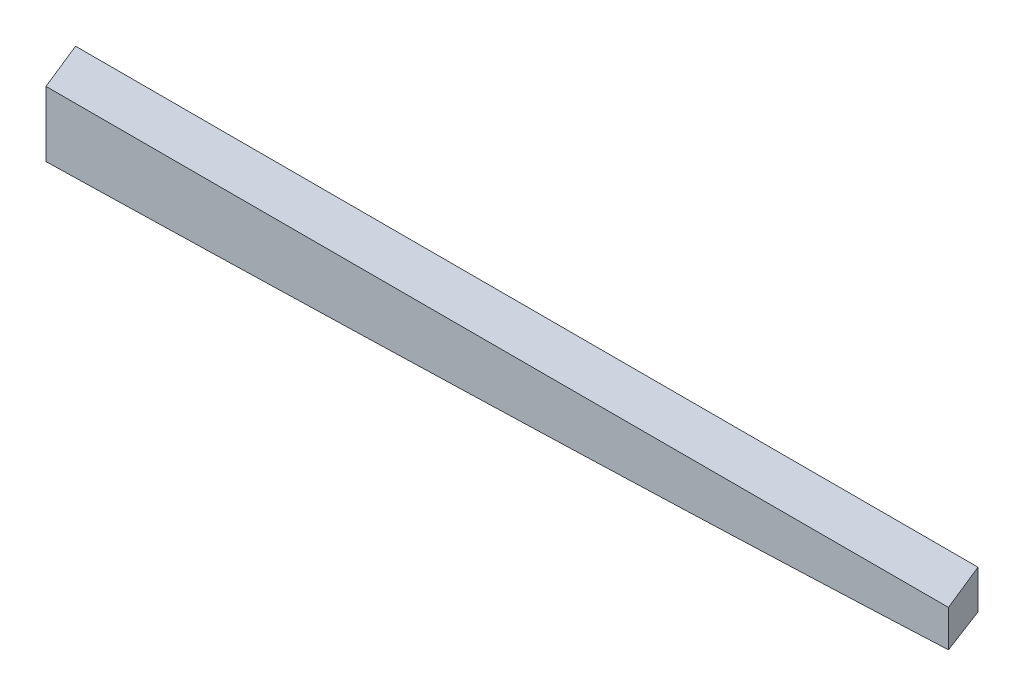
ISO-10303-21;
HEADER;
FILE_DESCRIPTION(('STEP AP214'),'2;1');
FILE_NAME('part.step','',(''),(''),'','','');
FILE_SCHEMA(('AUTOMOTIVE_DESIGN { 1 0 10303 214 1 1 1 1 }'));
ENDSEC;
DATA;
#1=APPLICATION_CONTEXT('core data for automotive mechanical design processes');
#2=APPLICATION_PROTOCOL_DEFINITION('international standard','automotive_design',2000,#1);
#3=PRODUCT_CONTEXT('',#1,'mechanical');
#4=PRODUCT('Part','Part','',(#3));
#5=PRODUCT_RELATED_PRODUCT_CATEGORY('part','',(#4));
#6=PRODUCT_DEFINITION_FORMATION('','',#4);
#7=PRODUCT_DEFINITION_CONTEXT('part definition',#1,'design');
#8=PRODUCT_DEFINITION('design','',#6,#7);
#9=PRODUCT_DEFINITION_SHAPE('','',#8);
#10=(LENGTH_UNIT() NAMED_UNIT(*) SI_UNIT(.MILLI.,.METRE.));
#11=(NAMED_UNIT(*) PLANE_ANGLE_UNIT() SI_UNIT($,.RADIAN.));
#12=(NAMED_UNIT(*) SI_UNIT($,.STERADIAN.) SOLID_ANGLE_UNIT());
#13=UNCERTAINTY_MEASURE_WITH_UNIT(LENGTH_MEASURE(1.E-05),#10,'distance_accuracy_value','');
#14=(GEOMETRIC_REPRESENTATION_CONTEXT(3) GLOBAL_UNCERTAINTY_ASSIGNED_CONTEXT((#13)) GLOBAL_UNIT_ASSIGNED_CONTEXT((#10,
#11,#12)) REPRESENTATION_CONTEXT('',''));
#15=CARTESIAN_POINT('',(0.,0.,0.));
#16=DIRECTION('',(0.,0.,1.));
#17=DIRECTION('',(1.,0.,0.));
#18=AXIS2_PLACEMENT_3D('',#15,#16,#17);
#19=CARTESIAN_POINT('',(0.,0.,0.));
#20=DIRECTION('',(0.,-1.,0.));
#21=DIRECTION('',(0.,0.,1.));
#22=AXIS2_PLACEMENT_3D('',#19,#20,#21);
#23=PLANE('',#22);
#24=DIRECTION('',(0.374606593415921,0.,0.927183854566784));
#25=VECTOR('',#24,1.);
#26=CARTESIAN_POINT('',(197.742614302339,0.,-1.61493343177803E-12));
#27=LINE('',#26,#25);
#28=CARTESIAN_POINT('',(193.637707847854,0.,-10.1600000000016));
#29=VERTEX_POINT('',#28);
#30=CARTESIAN_POINT('',(197.742614302339,0.,-1.61493343177803E-12));
#31=VERTEX_POINT('',#30);
#32=EDGE_CURVE('E89',#29,#31,#27,.T.);
#33=ORIENTED_EDGE('',*,*,#32,.F.);
#34=DIRECTION('',(1.,0.,0.));
#35=VECTOR('',#34,1.);
#36=CARTESIAN_POINT('',(193.637707847854,0.,-10.1600000000016));
#37=LINE('',#36,#35);
#38=CARTESIAN_POINT('',(8.7229262157812,0.,-10.1600000000026));
#39=VERTEX_POINT('',#38);
#40=EDGE_CURVE('E127',#39,#29,#37,.T.);
#41=ORIENTED_EDGE('',*,*,#40,.F.);
#42=DIRECTION('',(-0.37460659341592,0.,-0.927183854566784));
#43=VECTOR('',#42,1.);
#44=CARTESIAN_POINT('',(8.7229262157812,0.,-10.1600000000026));
#45=LINE('',#44,#43);
#46=CARTESIAN_POINT('',(12.8278326702665,0.,-2.56228069837412E-12));
#47=VERTEX_POINT('',#46);
#48=EDGE_CURVE('E101',#47,#39,#45,.T.);
#49=ORIENTED_EDGE('',*,*,#48,.F.);
#50=DIRECTION('',(-1.,0.,0.));
#51=VECTOR('',#50,1.);
#52=CARTESIAN_POINT('',(12.8278326702665,0.,-2.56228069837412E-12));
#53=LINE('',#52,#51);
#54=EDGE_CURVE('E133',#31,#47,#53,.T.);
#55=ORIENTED_EDGE('',*,*,#54,.F.);
#56=EDGE_LOOP('',(#33,#41,#49,#55));
#57=FACE_BOUND('',#56,.T.);
#58=ADVANCED_FACE('F38',(#57),#23,.F.);
#59=CARTESIAN_POINT('',(12.8278326702665,-198.003452270721,-2.56228069837412E-12));
#60=DIRECTION('',(0.,0.,1.));
#61=DIRECTION('',(-1.,0.,0.));
#62=AXIS2_PLACEMENT_3D('',#59,#60,#61);
#63=PLANE('',#62);
#64=DIRECTION('',(0.,1.,0.));
#65=VECTOR('',#64,1.);
#66=CARTESIAN_POINT('',(197.742614302339,-198.003452270721,-1.61493343177803E-12));
#67=LINE('',#66,#65);
#68=CARTESIAN_POINT('',(197.742614302339,-7.5317230359969,-1.57968256531138E-12));
#69=VERTEX_POINT('',#68);
#70=EDGE_CURVE('E108',#69,#31,#67,.T.);
#71=ORIENTED_EDGE('',*,*,#70,.T.);
#72=ORIENTED_EDGE('',*,*,#54,.T.);
#73=DIRECTION('',(0.,1.,0.));
#74=VECTOR('',#73,1.);
#75=CARTESIAN_POINT('',(12.8278326702665,-198.003452270721,-2.56228069837412E-12));
#76=LINE('',#75,#74);
#77=CARTESIAN_POINT('',(12.8278326702665,-13.3547069849368,-2.56228069837412E-12));
#78=VERTEX_POINT('',#77);
#79=EDGE_CURVE('E104',#78,#47,#76,.T.);
#80=ORIENTED_EDGE('',*,*,#79,.F.);
#81=CARTESIAN_POINT('',(197.742614302339,-7.5317230359969,-1.6124868289595E-12));
#82=CARTESIAN_POINT('',(193.851778283781,-7.71088429674555,-1.63212793652857E-12));
#83=CARTESIAN_POINT('',(189.96069995208,-7.88471431067913,-1.65363584935659E-12));
#84=CARTESIAN_POINT('',(182.178119370458,-8.2225051039184,-1.69583830875417E-12));
#85=CARTESIAN_POINT('',(178.286617121062,-8.38646589531654,-1.71653285632032E-12));
#86=CARTESIAN_POINT('',(166.611635581868,-8.86473150436399,-1.77057569974853E-12));
#87=CARTESIAN_POINT('',(158.827597190313,-9.16542340462161,-1.79588381898141E-12));
#88=CARTESIAN_POINT('',(143.258450648619,-9.73625759984342,-1.87439663728985E-12));
#89=CARTESIAN_POINT('',(135.473342504306,-10.0064000550564,-1.92760119002488E-12));
#90=CARTESIAN_POINT('',(123.795026768125,-10.3924159946477,-1.99695219322667E-12));
#91=CARTESIAN_POINT('',(119.902133215319,-10.5178887292485,-2.01832660940103E-12));
#92=CARTESIAN_POINT('',(112.116161540924,-10.7629760668103,-2.04900685143913E-12));
#93=CARTESIAN_POINT('',(108.223083419337,-10.8825906697767,-2.05831267731399E-12));
#94=CARTESIAN_POINT('',(99.247031050901,-11.1522112965935,-2.10087710408331E-12));
#95=CARTESIAN_POINT('',(94.1640002721749,-11.3003341167566,-2.14058652577659E-12));
#96=CARTESIAN_POINT('',(83.9977073110466,-11.5884943608872,-2.20266263372228E-12));
#97=CARTESIAN_POINT('',(78.9144451285155,-11.7285317802989,-2.22502931020294E-12));
#98=CARTESIAN_POINT('',(68.7477248411839,-12.0014363319971,-2.27447373355178E-12));
#99=CARTESIAN_POINT('',(63.6642667362387,-12.1343034588893,-2.30155148396411E-12));
#100=CARTESIAN_POINT('',(53.4972728891866,-12.3936774767917,-2.35421104233448E-12));
#101=CARTESIAN_POINT('',(48.4137371497629,-12.5201844731845,-2.37979287507991E-12));
#102=CARTESIAN_POINT('',(38.2465333821126,-12.7675642810465,-2.43223241451523E-12));
#103=CARTESIAN_POINT('',(33.1628653540064,-12.8884370974692,-2.45909012008338E-12));
#104=CARTESIAN_POINT('',(22.995425228678,-13.1251730449386,-2.50920157266223E-12));
#105=CARTESIAN_POINT('',(17.9116531317468,-13.2410361884709,-2.53245532865541E-12));
#106=CARTESIAN_POINT('',(12.8278326740861,-13.3547069849368,-2.55146726839058E-12));
#107=B_SPLINE_CURVE_WITH_KNOTS('',3,(#81,#82,#83,#84,#85,#86,#87,#88,#89,#90,#91,#92,#93,#94,
#95,#96,#97,#98,#99,#100,#101,#102,#103,#104,#105,#106),.UNSPECIFIED.,.F.,.F.,(4,2,2,2,2,2,2,2,
2,2,2,2,4),(0.,11.6848674813038,23.3697206451937,46.7391737801919,70.1085043237511,
81.7932459537487,93.4779875729803,108.733545599959,123.989112222667,139.244690322221,
154.500015564952,169.755327395282,185.010601202761),.UNSPECIFIED.);
#108=EDGE_CURVE('E11',#69,#78,#107,.T.);
#109=ORIENTED_EDGE('',*,*,#108,.F.);
#110=EDGE_LOOP('',(#71,#72,#80,#109));
#111=FACE_BOUND('',#110,.T.);
#112=ADVANCED_FACE('F152',(#111),#63,.T.);
#113=CARTESIAN_POINT('',(8.7229262157812,-198.003452270721,-10.1600000000026));
#114=DIRECTION('',(-0.927183854566784,0.,0.37460659341592));
#115=DIRECTION('',(-0.37460659341592,0.,-0.927183854566784));
#116=AXIS2_PLACEMENT_3D('',#113,#114,#115);
#117=PLANE('',#116);
#118=ORIENTED_EDGE('',*,*,#79,.T.);
#119=ORIENTED_EDGE('',*,*,#48,.T.);
#120=DIRECTION('',(0.,1.,0.));
#121=VECTOR('',#120,1.);
#122=CARTESIAN_POINT('',(8.7229262157812,-198.003452270721,-10.1600000000026));
#123=LINE('',#122,#121);
#124=CARTESIAN_POINT('',(8.72292621578126,-13.3708940330043,-10.1600000000026));
#125=VERTEX_POINT('',#124);
#126=EDGE_CURVE('E86',#125,#39,#123,.T.);
#127=ORIENTED_EDGE('',*,*,#126,.F.);
#128=CARTESIAN_POINT('',(113.639406371967,-5.40386964217282,249.517400741278));
#129=CARTESIAN_POINT('',(75.4785450254213,-13.185760843084,155.065954507403));
#130=CARTESIAN_POINT('',(19.0659570087758,-13.4131359684737,15.4398995402174));
#131=CARTESIAN_POINT('',(-37.5687525561954,-13.4156283461592,-124.735925551089));
#132=CARTESIAN_POINT('',(-55.4579622929203,-0.805593780103361,-169.013273388463));
#133=B_SPLINE_CURVE_WITH_KNOTS('',3,(#128,#129,#130,#131,#132),.UNSPECIFIED.,.F.,.F.,(4,1,4),
(0.,0.6764636902794,1.),.UNSPECIFIED.);
#134=EDGE_CURVE('E58',#78,#125,#133,.T.);
#135=ORIENTED_EDGE('',*,*,#134,.F.);
#136=EDGE_LOOP('',(#118,#119,#127,#135));
#137=FACE_BOUND('',#136,.T.);
#138=ADVANCED_FACE('F99',(#137),#117,.T.);
#139=CARTESIAN_POINT('',(193.637707847854,-198.003452270721,-10.1600000000016));
#140=DIRECTION('',(0.,0.,-1.));
#141=DIRECTION('',(1.,0.,0.));
#142=AXIS2_PLACEMENT_3D('',#139,#140,#141);
#143=PLANE('',#142);
#144=ORIENTED_EDGE('',*,*,#126,.T.);
#145=ORIENTED_EDGE('',*,*,#40,.T.);
#146=DIRECTION('',(0.,1.,0.));
#147=VECTOR('',#146,1.);
#148=CARTESIAN_POINT('',(193.637707847854,-198.003452270721,-10.1600000000016));
#149=LINE('',#148,#147);
#150=CARTESIAN_POINT('',(193.637707847854,-7.93438972636536,-10.1600000000016));
#151=VERTEX_POINT('',#150);
#152=EDGE_CURVE('E50',#151,#29,#149,.T.);
#153=ORIENTED_EDGE('',*,*,#152,.F.);
#154=CARTESIAN_POINT('',(8.72292621578122,-13.3708940330043,-10.1600000000026));
#155=CARTESIAN_POINT('',(12.6169097102044,-13.2879243785269,-10.1600000000025));
#156=CARTESIAN_POINT('',(16.5108696095522,-13.2038467262568,-10.1600000000025));
#157=CARTESIAN_POINT('',(24.2987356717337,-13.0332269147253,-10.1600000000025));
#158=CARTESIAN_POINT('',(28.1926418345633,-12.9466847552847,-10.1600000000025));
#159=CARTESIAN_POINT('',(39.8743021965772,-12.6829880191056,-10.1600000000024));
#160=CARTESIAN_POINT('',(47.6619651213221,-12.5017638865648,-10.1600000000024));
#161=CARTESIAN_POINT('',(63.2369802282674,-12.1261761630107,-10.1600000000023));
#162=CARTESIAN_POINT('',(71.0243324103006,-11.9318125650171,-10.1600000000022));
#163=CARTESIAN_POINT('',(82.7050379847135,-11.6283156492407,-10.1600000000022));
#164=CARTESIAN_POINT('',(86.5985469259469,-11.5251582534417,-10.1600000000022));
#165=CARTESIAN_POINT('',(94.385448544897,-11.3144512369674,-10.1600000000021));
#166=CARTESIAN_POINT('',(98.2788412225396,-11.2069016135528,-10.1600000000021));
#167=CARTESIAN_POINT('',(107.254588506944,-10.9533866638809,-10.1600000000021));
#168=CARTESIAN_POINT('',(112.336895264854,-10.8057207807796,-10.160000000002));
#169=CARTESIAN_POINT('',(122.501229477506,-10.5010658547676,-10.160000000002));
#170=CARTESIAN_POINT('',(127.583256932275,-10.3440768127142,-10.160000000002));
#171=CARTESIAN_POINT('',(137.746968995703,-10.0195463044249,-10.1600000000019));
#172=CARTESIAN_POINT('',(142.828653604818,-9.85200485246797,-10.1600000000019));
#173=CARTESIAN_POINT('',(152.99170894385,-9.50498692097949,-10.1600000000018));
#174=CARTESIAN_POINT('',(158.073079666359,-9.32551022400698,-10.1600000000018));
#175=CARTESIAN_POINT('',(168.235337127199,-8.95309831191395,-10.1600000000017));
#176=CARTESIAN_POINT('',(173.316223864847,-8.76016307810214,-10.1600000000017));
#177=CARTESIAN_POINT('',(183.477427977176,-8.35910198663456,-10.1600000000017));
#178=CARTESIAN_POINT('',(188.557745348189,-8.15097603622355,-10.1600000000017));
#179=CARTESIAN_POINT('',(193.637707847854,-7.93438972636536,-10.1600000000017));
#180=B_SPLINE_CURVE_WITH_KNOTS('',3,(#154,#155,#156,#157,#158,#159,#160,#161,#162,#163,#164,
#165,#166,#167,#168,#169,#170,#171,#172,#173,#174,#175,#176,#177,#178,#179),.UNSPECIFIED.,.F.,
.F.,(4,2,2,2,2,2,2,2,2,2,2,2,4),(0.,11.6846017330771,23.3692043154307,46.7385089462508,
70.1078259922931,81.7924496989285,93.47708069286,108.730427493687,123.983772892124,
139.237097651087,154.490700377283,169.744324288185,184.998041346238),.UNSPECIFIED.);
#181=EDGE_CURVE('E84',#125,#151,#180,.T.);
#182=ORIENTED_EDGE('',*,*,#181,.F.);
#183=EDGE_LOOP('',(#144,#145,#153,#182));
#184=FACE_BOUND('',#183,.T.);
#185=ADVANCED_FACE('F85',(#184),#143,.T.);
#186=CARTESIAN_POINT('',(197.742614302339,-198.003452270721,-1.61493343177803E-12));
#187=DIRECTION('',(0.927183854566784,0.,-0.374606593415921));
#188=DIRECTION('',(0.374606593415921,0.,0.927183854566784));
#189=AXIS2_PLACEMENT_3D('',#186,#187,#188);
#190=PLANE('',#189);
#191=ORIENTED_EDGE('',*,*,#152,.T.);
#192=ORIENTED_EDGE('',*,*,#32,.T.);
#193=ORIENTED_EDGE('',*,*,#70,.F.);
#194=CARTESIAN_POINT('',(143.412696143161,2833.48990261995,-134.471266182964));
#195=DIRECTION('',(0.927183854566784,0.,-0.37460659341592));
#196=DIRECTION('',(-0.374595101191309,-0.00783296184731904,-0.927155410312733));
#197=AXIS2_PLACEMENT_3D('',#194,#195,#196);
#198=ELLIPSE('',#197,3398.12195786294,2843.927294434);
#199=EDGE_CURVE('E90',#69,#151,#198,.T.);
#200=ORIENTED_EDGE('',*,*,#199,.T.);
#201=EDGE_LOOP('',(#191,#192,#193,#200));
#202=FACE_BOUND('',#201,.T.);
#203=ADVANCED_FACE('F40',(#202),#190,.T.);
#204=CARTESIAN_POINT('',(-55.4579622929203,-0.805593780103361,-169.013273388463));
#205=CARTESIAN_POINT('',(129.457038163675,-0.805593929114912,-169.012731778764));
#206=CARTESIAN_POINT('',(-51.9241099828508,-3.29659256859822,-160.266681993895));
#207=CARTESIAN_POINT('',(131.873885299645,-2.44130818532167,-163.030825205808));
#208=CARTESIAN_POINT('',(-44.7681325619101,-7.32836318314609,-142.555016355982));
#209=CARTESIAN_POINT('',(136.750685821161,-5.2896135231759,-150.960320348269));
#210=CARTESIAN_POINT('',(-33.8940627543828,-10.9761744546051,-115.64074913224));
#211=CARTESIAN_POINT('',(144.159114207438,-8.27702846951049,-132.62381664492));
#212=CARTESIAN_POINT('',(-22.9592728442453,-12.7985183605706,-88.5761943807906));
#213=CARTESIAN_POINT('',(151.624673731398,-9.97000758282251,-114.14590841377));
#214=CARTESIAN_POINT('',(-15.6542234938785,-13.2005291414816,-70.4955627701409));
#215=CARTESIAN_POINT('',(156.615798281771,-10.2332991329444,-101.792441655378));
#216=CARTESIAN_POINT('',(-10.6903983915027,-13.3350068720629,-58.2096645165929));
#217=CARTESIAN_POINT('',(160.001868802791,-10.1188005600372,-93.4116230240626));
#218=CARTESIAN_POINT('',(-8.07217015377651,-13.3798229212347,-51.7293222261537));
#219=CARTESIAN_POINT('',(161.787718591269,-10.054213696795,-88.9914896904241));
#220=CARTESIAN_POINT('',(-4.14458327453596,-13.3956703477279,-42.0082035756953));
#221=CARTESIAN_POINT('',(164.466300054892,-9.94474375287142,-82.3617679240068));
#222=CARTESIAN_POINT('',(-0.216825796522348,-13.3893005174341,-32.2866626784566));
#223=CARTESIAN_POINT('',(167.144688351969,-9.82268525127187,-75.7325242615655));
#224=CARTESIAN_POINT('',(3.71109054404176,-13.3839147941131,-22.5647285826075));
#225=CARTESIAN_POINT('',(169.822883535052,-9.68803928338056,-69.1037585730357));
#226=CARTESIAN_POINT('',(7.63915286757893,-13.3748815307504,-12.842433166221));
#227=CARTESIAN_POINT('',(172.500885656688,-9.54080694058172,-62.475470728353));
#228=CARTESIAN_POINT('',(12.8767468083496,-13.3570498959533,0.121066740112913));
#229=CARTESIAN_POINT('',(176.071297807007,-9.32771677215219,-53.6383905538195));
#230=CARTESIAN_POINT('',(19.4240351809675,-13.3182513925059,16.3261741167044));
#231=CARTESIAN_POINT('',(180.533830604039,-9.02989358126757,-42.593234294948));
#232=CARTESIAN_POINT('',(27.2811300658672,-13.2313208682326,35.7731663723636));
#233=CARTESIAN_POINT('',(185.888098555484,-8.62217771472351,-29.3409560786592));
#234=CARTESIAN_POINT('',(35.138405321156,-13.089210066917,55.2206050604017));
#235=CARTESIAN_POINT('',(191.241595288042,-8.16413151854455,-16.0905866960966));
#236=CARTESIAN_POINT('',(42.995668672569,-12.8774530793599,74.6680142853133));
#237=CARTESIAN_POINT('',(196.594320987822,-7.6557527005783,-2.84212568662955));
#238=CARTESIAN_POINT('',(53.4716318936432,-12.482731800034,100.596933130666));
#239=CARTESIAN_POINT('',(203.730260791964,-6.91080105803705,14.8199451093732));
#240=CARTESIAN_POINT('',(66.5651199821236,-11.7422080133171,133.004453363826));
#241=CARTESIAN_POINT('',(212.648258895729,-5.85376848963031,36.892764974791));
#242=CARTESIAN_POINT('',(82.2714287438006,-10.3417958902919,171.878931695549));
#243=CARTESIAN_POINT('',(223.346773255791,-4.38387852996693,63.3725172184661));
#244=CARTESIAN_POINT('',(97.9667149716851,-8.31421385526924,210.726128298791));
#245=CARTESIAN_POINT('',(234.042203529206,-2.71243563952127,89.8446360798259));
#246=CARTESIAN_POINT('',(108.418211399615,-6.46859328256991,236.594489706088));
#247=CARTESIAN_POINT('',(241.170431977799,-1.46364489167883,107.487620601086));
#248=CARTESIAN_POINT('',(113.639406371967,-5.40386964217282,249.517400741278));
#249=CARTESIAN_POINT('',(244.734031016362,-0.80559392911532,116.307837732279));
#250=B_SPLINE_SURFACE_WITH_KNOTS('',3,1,((#204,#205),(#206,#207),(#208,#209),(#210,#211),(#212,
#213),(#214,#215),(#216,#217),(#218,#219),(#220,#221),(#222,#223),(#224,#225),(#226,#227),(#228,
#229),(#230,#231),(#232,#233),(#234,#235),(#236,#237),(#238,#239),(#240,#241),(#242,#243),(#244,
#245),(#246,#247),(#248,#249)),.UNSPECIFIED.,.F.,.F.,.F.,(4,1,1,1,2,1,1,1,1,1,1,1,1,1,1,1,1,1,1,
4),(2,2),(0.,0.0646770999637058,0.129354199927412,0.194031299891118,0.258708399854823,
0.28187376235936,0.305039124863897,0.328204487368434,0.35136984987297,0.374535212377507,
0.397700574882044,0.444031299891117,0.490362024900191,0.536692749909264,0.583023474918338,
0.629354199927412,0.722015649945559,0.814677099963706,0.907338549981853,1.),(0.,1.),.UNSPECIFIED.);
#251=ORIENTED_EDGE('',*,*,#181,.T.);
#252=ORIENTED_EDGE('',*,*,#199,.F.);
#253=ORIENTED_EDGE('',*,*,#108,.T.);
#254=ORIENTED_EDGE('',*,*,#134,.T.);
#255=EDGE_LOOP('',(#251,#252,#253,#254));
#256=FACE_BOUND('',#255,.T.);
#257=ADVANCED_FACE('F93',(#256),#250,.F.);
#258=CLOSED_SHELL('',(#58,#112,#138,#185,#203,#257));
#259=MANIFOLD_SOLID_BREP('B2',#258);
#260=ADVANCED_BREP_SHAPE_REPRESENTATION('',(#18,#259),#14);
#261=SHAPE_DEFINITION_REPRESENTATION(#9,#260);
ENDSEC;
END-ISO-10303-21;
